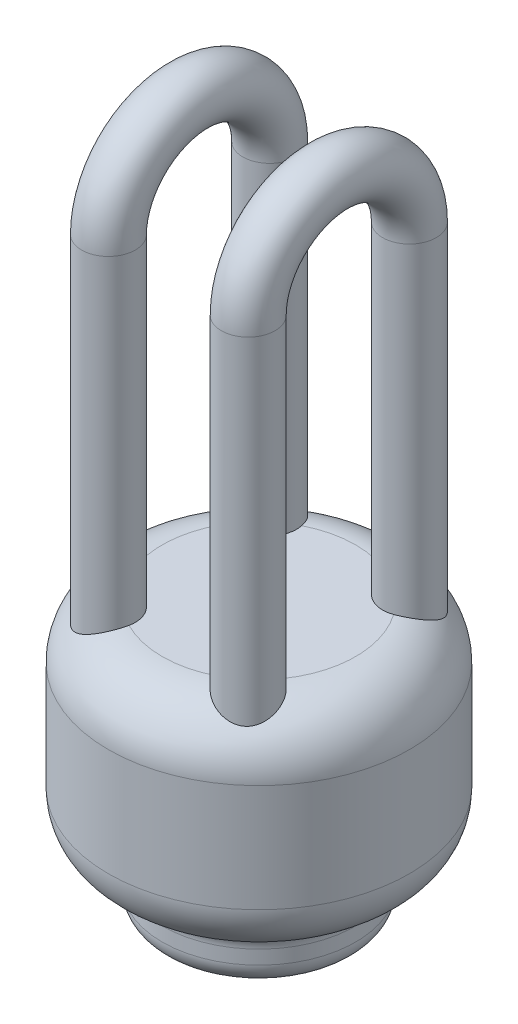
ISO-10303-21;
HEADER;
FILE_DESCRIPTION(('STEP AP214'),'2;1');
FILE_NAME('part.step','',(''),(''),'','','');
FILE_SCHEMA(('AUTOMOTIVE_DESIGN { 1 0 10303 214 1 1 1 1 }'));
ENDSEC;
DATA;
#1=APPLICATION_CONTEXT('core data for automotive mechanical design processes');
#2=APPLICATION_PROTOCOL_DEFINITION('international standard','automotive_design',2000,#1);
#3=PRODUCT_CONTEXT('',#1,'mechanical');
#4=PRODUCT('Part','Part','',(#3));
#5=PRODUCT_RELATED_PRODUCT_CATEGORY('part','',(#4));
#6=PRODUCT_DEFINITION_FORMATION('','',#4);
#7=PRODUCT_DEFINITION_CONTEXT('part definition',#1,'design');
#8=PRODUCT_DEFINITION('design','',#6,#7);
#9=PRODUCT_DEFINITION_SHAPE('','',#8);
#10=(LENGTH_UNIT() NAMED_UNIT(*) SI_UNIT(.MILLI.,.METRE.));
#11=(NAMED_UNIT(*) PLANE_ANGLE_UNIT() SI_UNIT($,.RADIAN.));
#12=(NAMED_UNIT(*) SI_UNIT($,.STERADIAN.) SOLID_ANGLE_UNIT());
#13=UNCERTAINTY_MEASURE_WITH_UNIT(LENGTH_MEASURE(1.E-05),#10,'distance_accuracy_value','');
#14=(GEOMETRIC_REPRESENTATION_CONTEXT(3) GLOBAL_UNCERTAINTY_ASSIGNED_CONTEXT((#13)) GLOBAL_UNIT_ASSIGNED_CONTEXT((#10,
#11,#12)) REPRESENTATION_CONTEXT('',''));
#15=CARTESIAN_POINT('',(0.,0.,0.));
#16=DIRECTION('',(0.,0.,1.));
#17=DIRECTION('',(1.,0.,0.));
#18=AXIS2_PLACEMENT_3D('',#15,#16,#17);
#19=CARTESIAN_POINT('',(0.,40.,0.));
#20=DIRECTION('',(0.,-1.,0.));
#21=DIRECTION('',(0.,0.,-1.));
#22=AXIS2_PLACEMENT_3D('',#19,#20,#21);
#23=CYLINDRICAL_SURFACE('',#22,28.);
#24=CARTESIAN_POINT('',(0.,10.,0.));
#25=DIRECTION('',(0.,1.,0.));
#26=DIRECTION('',(0.,0.,1.));
#27=AXIS2_PLACEMENT_3D('',#24,#25,#26);
#28=CIRCLE('',#27,28.);
#29=CARTESIAN_POINT('',(0.,10.,28.));
#30=VERTEX_POINT('',#29);
#31=EDGE_CURVE('E146',#30,#30,#28,.T.);
#32=ORIENTED_EDGE('',*,*,#31,.T.);
#33=EDGE_LOOP('',(#32));
#34=FACE_BOUND('',#33,.T.);
#35=CARTESIAN_POINT('',(0.,30.,0.));
#36=DIRECTION('',(0.,1.,0.));
#37=DIRECTION('',(0.,0.,1.));
#38=AXIS2_PLACEMENT_3D('',#35,#36,#37);
#39=CIRCLE('',#38,28.);
#40=CARTESIAN_POINT('',(0.,30.,28.));
#41=VERTEX_POINT('',#40);
#42=EDGE_CURVE('E143',#41,#41,#39,.F.);
#43=ORIENTED_EDGE('',*,*,#42,.T.);
#44=EDGE_LOOP('',(#43));
#45=FACE_BOUND('',#44,.T.);
#46=ADVANCED_FACE('F62',(#34,#45),#23,.T.);
#47=CARTESIAN_POINT('',(0.,40.,0.));
#48=DIRECTION('',(0.,1.,0.));
#49=DIRECTION('',(0.,0.,1.));
#50=AXIS2_PLACEMENT_3D('',#47,#48,#49);
#51=PLANE('',#50);
#52=CARTESIAN_POINT('',(13.,40.,-15.));
#53=DIRECTION('',(0.,-1.,0.));
#54=DIRECTION('',(0.,0.,-1.));
#55=AXIS2_PLACEMENT_3D('',#52,#53,#54);
#56=CIRCLE('',#55,5.);
#57=CARTESIAN_POINT('',(14.7503347191497,40.,-10.3163765767369));
#58=VERTEX_POINT('',#57);
#59=CARTESIAN_POINT('',(8.11514751435278,40.,-16.0668721542276));
#60=VERTEX_POINT('',#59);
#61=EDGE_CURVE('E120',#58,#60,#56,.T.);
#62=ORIENTED_EDGE('',*,*,#61,.T.);
#63=CARTESIAN_POINT('',(0.,40.,0.));
#64=DIRECTION('',(0.,1.,0.));
#65=DIRECTION('',(0.,0.,1.));
#66=AXIS2_PLACEMENT_3D('',#63,#64,#65);
#67=CIRCLE('',#66,18.);
#68=CARTESIAN_POINT('',(-8.11514751435278,40.,-16.0668721542276));
#69=VERTEX_POINT('',#68);
#70=EDGE_CURVE('E108',#60,#69,#67,.T.);
#71=ORIENTED_EDGE('',*,*,#70,.T.);
#72=CARTESIAN_POINT('',(-13.,40.,-15.));
#73=DIRECTION('',(0.,1.,0.));
#74=DIRECTION('',(0.,0.,-1.));
#75=AXIS2_PLACEMENT_3D('',#72,#73,#74);
#76=CIRCLE('',#75,5.);
#77=CARTESIAN_POINT('',(-14.7503347191497,40.,-10.3163765767369));
#78=VERTEX_POINT('',#77);
#79=EDGE_CURVE('E118',#69,#78,#76,.F.);
#80=ORIENTED_EDGE('',*,*,#79,.T.);
#81=CARTESIAN_POINT('',(0.,40.,0.));
#82=DIRECTION('',(0.,1.,0.));
#83=DIRECTION('',(0.,0.,1.));
#84=AXIS2_PLACEMENT_3D('',#81,#82,#83);
#85=CIRCLE('',#84,18.);
#86=CARTESIAN_POINT('',(-14.7503347191497,40.,10.3163765767369));
#87=VERTEX_POINT('',#86);
#88=EDGE_CURVE('E110',#78,#87,#85,.T.);
#89=ORIENTED_EDGE('',*,*,#88,.T.);
#90=CARTESIAN_POINT('',(-13.,40.,15.));
#91=DIRECTION('',(0.,-1.,0.));
#92=DIRECTION('',(0.,0.,1.));
#93=AXIS2_PLACEMENT_3D('',#90,#91,#92);
#94=CIRCLE('',#93,5.);
#95=CARTESIAN_POINT('',(-8.11514751435278,40.,16.0668721542276));
#96=VERTEX_POINT('',#95);
#97=EDGE_CURVE('E131',#96,#87,#94,.F.);
#98=ORIENTED_EDGE('',*,*,#97,.F.);
#99=CARTESIAN_POINT('',(0.,40.,0.));
#100=DIRECTION('',(0.,1.,0.));
#101=DIRECTION('',(0.,0.,1.));
#102=AXIS2_PLACEMENT_3D('',#99,#100,#101);
#103=CIRCLE('',#102,18.);
#104=CARTESIAN_POINT('',(8.11514751435278,40.,16.0668721542276));
#105=VERTEX_POINT('',#104);
#106=EDGE_CURVE('E77',#96,#105,#103,.T.);
#107=ORIENTED_EDGE('',*,*,#106,.T.);
#108=CARTESIAN_POINT('',(13.,40.,15.));
#109=DIRECTION('',(0.,1.,0.));
#110=DIRECTION('',(0.,0.,1.));
#111=AXIS2_PLACEMENT_3D('',#108,#109,#110);
#112=CIRCLE('',#111,5.);
#113=CARTESIAN_POINT('',(14.7503347191497,40.,10.3163765767369));
#114=VERTEX_POINT('',#113);
#115=EDGE_CURVE('E141',#114,#105,#112,.T.);
#116=ORIENTED_EDGE('',*,*,#115,.F.);
#117=CARTESIAN_POINT('',(0.,40.,0.));
#118=DIRECTION('',(0.,1.,0.));
#119=DIRECTION('',(0.,0.,1.));
#120=AXIS2_PLACEMENT_3D('',#117,#118,#119);
#121=CIRCLE('',#120,18.);
#122=EDGE_CURVE('E149',#114,#58,#121,.T.);
#123=ORIENTED_EDGE('',*,*,#122,.T.);
#124=EDGE_LOOP('',(#62,#71,#80,#89,#98,#107,#116,#123));
#125=FACE_BOUND('',#124,.T.);
#126=ADVANCED_FACE('F117',(#125),#51,.T.);
#127=CARTESIAN_POINT('',(13.,40.,-15.));
#128=DIRECTION('',(0.,1.,0.));
#129=DIRECTION('',(0.,0.,1.));
#130=AXIS2_PLACEMENT_3D('',#127,#128,#129);
#131=CYLINDRICAL_SURFACE('',#130,5.);
#132=CARTESIAN_POINT('',(13.,100.,-15.));
#133=DIRECTION('',(0.,-1.,0.));
#134=DIRECTION('',(0.,0.,-1.));
#135=AXIS2_PLACEMENT_3D('',#132,#133,#134);
#136=CIRCLE('',#135,5.);
#137=CARTESIAN_POINT('',(13.,100.,-20.));
#138=VERTEX_POINT('',#137);
#139=EDGE_CURVE('E135',#138,#138,#136,.T.);
#140=ORIENTED_EDGE('',*,*,#139,.T.);
#141=EDGE_LOOP('',(#140));
#142=FACE_BOUND('',#141,.T.);
#143=ORIENTED_EDGE('',*,*,#61,.F.);
#144=CARTESIAN_POINT('',(14.7503347191497,40.,-10.3163765767369));
#145=CARTESIAN_POINT('',(14.8715136222727,40.0000248233862,-10.3616397112253));
#146=CARTESIAN_POINT('',(14.9909217024779,39.9976477739751,-10.4116453030019));
#147=CARTESIAN_POINT('',(15.2253267481526,39.9879663805734,-10.5206510724073));
#148=CARTESIAN_POINT('',(15.3403244765662,39.9806628929048,-10.5796496854744));
#149=CARTESIAN_POINT('',(15.5646501574894,39.9610429435948,-10.7059241160429));
#150=CARTESIAN_POINT('',(15.6739982017275,39.9487458558832,-10.773167250837));
#151=CARTESIAN_POINT('',(15.8867430797801,39.9191845540323,-10.9155057552129));
#152=CARTESIAN_POINT('',(15.9901399502426,39.9019203704848,-10.9906010764322));
#153=CARTESIAN_POINT('',(16.1902906243138,39.8625791430644,-11.1479564401782));
#154=CARTESIAN_POINT('',(16.2870470876147,39.8405040410841,-11.2302135838653));
#155=CARTESIAN_POINT('',(16.4734371725936,39.791788944566,-11.4012144658803));
#156=CARTESIAN_POINT('',(16.5630680778671,39.7651472212408,-11.489960653445));
#157=CARTESIAN_POINT('',(16.8206020576563,39.6788217836178,-11.7648886595012));
#158=CARTESIAN_POINT('',(16.9772256769765,39.6127219166901,-11.9598227581244));
#159=CARTESIAN_POINT('',(17.2634574005825,39.463739560605,-12.375263031102));
#160=CARTESIAN_POINT('',(17.3917105096764,39.3802846553234,-12.596486108486));
#161=CARTESIAN_POINT('',(17.6119446737389,39.2024170214425,-13.052170034242));
#162=CARTESIAN_POINT('',(17.7039116422739,39.1080000556976,-13.2866359832549));
#163=CARTESIAN_POINT('',(17.8601676941355,38.9005594151741,-13.7928677967437));
#164=CARTESIAN_POINT('',(17.9197799895744,38.7866651088197,-14.0657213971404));
#165=CARTESIAN_POINT('',(17.9930381016019,38.5563152194418,-14.616690783008));
#166=CARTESIAN_POINT('',(18.006638655244,38.4398572277089,-14.8948114796326));
#167=CARTESIAN_POINT('',(17.9865157072067,38.2008335937344,-15.4759691565353));
#168=CARTESIAN_POINT('',(17.948485307165,38.0786431167219,-15.7790269385135));
#169=CARTESIAN_POINT('',(17.8160305315425,37.8491290128266,-16.378339698949));
#170=CARTESIAN_POINT('',(17.7216753643802,37.7417873396901,-16.6746025634378));
#171=CARTESIAN_POINT('',(17.5054008999052,37.5768171310198,-17.1811699130311));
#172=CARTESIAN_POINT('',(17.3958096484407,37.5134487393941,-17.3948219769374));
#173=CARTESIAN_POINT('',(17.2072582482862,37.4341040998776,-17.7043688634401));
#174=CARTESIAN_POINT('',(17.1403819129654,37.4102741920404,-17.8057274059577));
#175=CARTESIAN_POINT('',(16.9988018305442,37.3684571404922,-18.0040650177123));
#176=CARTESIAN_POINT('',(16.9241013668519,37.3504675587691,-18.101045899786));
#177=CARTESIAN_POINT('',(16.7667730913225,37.3207682765727,-18.2903898269033));
#178=CARTESIAN_POINT('',(16.6841001728419,37.3090971172355,-18.3827214828532));
#179=CARTESIAN_POINT('',(16.5117779240374,37.2925742080336,-18.5612930919373));
#180=CARTESIAN_POINT('',(16.4221286338556,37.2877224189333,-18.6475330801176));
#181=CARTESIAN_POINT('',(16.2365924452043,37.2850017619636,-18.8131259786597));
#182=CARTESIAN_POINT('',(16.1407059958164,37.2871323918976,-18.892479383904));
#183=CARTESIAN_POINT('',(15.94354504352,37.2983031505684,-19.0436335998116));
#184=CARTESIAN_POINT('',(15.8422707982202,37.3073429492304,-19.1154347710848));
#185=CARTESIAN_POINT('',(15.6444689717636,37.3309345169229,-19.2449365156466));
#186=CARTESIAN_POINT('',(15.5483220311393,37.3449236337726,-19.3033233941927));
#187=CARTESIAN_POINT('',(15.3529839412171,37.3780251673999,-19.4131667122779));
#188=CARTESIAN_POINT('',(15.2537917830336,37.3971392986828,-19.4646208238815));
#189=CARTESIAN_POINT('',(14.9526712342147,37.4615095135753,-19.6083027409664));
#190=CARTESIAN_POINT('',(14.7470783459801,37.5138086247384,-19.689928378282));
#191=CARTESIAN_POINT('',(14.314339333164,37.6377194234693,-19.8299479103073));
#192=CARTESIAN_POINT('',(14.0867861450785,37.7105427509231,-19.8859563875095));
#193=CARTESIAN_POINT('',(13.6300963305656,37.8678764727255,-19.9655569278299));
#194=CARTESIAN_POINT('',(13.4009589995542,37.9523924342409,-19.9891334904062));
#195=CARTESIAN_POINT('',(12.9020365095677,38.1447012054112,-20.0063641444706));
#196=CARTESIAN_POINT('',(12.6325701876432,38.2539083141198,-19.9936787718936));
#197=CARTESIAN_POINT('',(12.1002834980953,38.4754468356709,-19.925713369431));
#198=CARTESIAN_POINT('',(11.8374692245881,38.5877809285624,-19.8703956448793));
#199=CARTESIAN_POINT('',(11.2910368838716,38.8234531362012,-19.7085172032883));
#200=CARTESIAN_POINT('',(11.0088371755882,38.9464448227586,-19.5964895488701));
#201=CARTESIAN_POINT('',(10.6017585701513,39.1224254140474,-19.3899512920908));
#202=CARTESIAN_POINT('',(10.4687002294076,39.1796970504897,-19.3146368522289));
#203=CARTESIAN_POINT('',(10.2089796951118,39.2905043348206,-19.1513485629835));
#204=CARTESIAN_POINT('',(10.0823141159186,39.3440419661204,-19.0633815115813));
#205=CARTESIAN_POINT('',(9.84016793361507,39.4449412603011,-18.8778901939276));
#206=CARTESIAN_POINT('',(9.72446670296769,39.4924392588911,-18.7807280359774));
#207=CARTESIAN_POINT('',(9.50133953425253,39.5822216803834,-18.5752422521669));
#208=CARTESIAN_POINT('',(9.39390901226302,39.62450899915,-18.4669248878869));
#209=CARTESIAN_POINT('',(9.18855683265766,39.7030975888196,-18.2398021140514));
#210=CARTESIAN_POINT('',(9.09062661371452,39.7394042702466,-18.1210063351297));
#211=CARTESIAN_POINT('',(8.90544203653154,39.8053871097563,-17.873748286111));
#212=CARTESIAN_POINT('',(8.81818088840743,39.8350674949086,-17.7452922488499));
#213=CARTESIAN_POINT('',(8.66480275900598,39.8842983932188,-17.4950084037662));
#214=CARTESIAN_POINT('',(8.59740842136688,39.9046207290601,-17.3741131016939));
#215=CARTESIAN_POINT('',(8.47260433507555,39.939451663183,-17.1264788405139));
#216=CARTESIAN_POINT('',(8.41519341462396,39.9539609440304,-16.9997405694343));
#217=CARTESIAN_POINT('',(8.31072210162637,39.9771381669158,-16.7407617115113));
#218=CARTESIAN_POINT('',(8.26371837916236,39.9857746331012,-16.6084954467705));
#219=CARTESIAN_POINT('',(8.18090742695463,39.9972238857242,-16.3402032626518));
#220=CARTESIAN_POINT('',(8.14510441952434,40.0000344782334,-16.2041759464573));
#221=CARTESIAN_POINT('',(8.11514751435278,40.,-16.0668721542276));
#222=B_SPLINE_CURVE_WITH_KNOTS('',3,(#144,#145,#146,#147,#148,#149,#150,#151,#152,#153,#154,
#155,#156,#157,#158,#159,#160,#161,#162,#163,#164,#165,#166,#167,#168,#169,#170,#171,#172,#173,
#174,#175,#176,#177,#178,#179,#180,#181,#182,#183,#184,#185,#186,#187,#188,#189,#190,#191,#192,
#193,#194,#195,#196,#197,#198,#199,#200,#201,#202,#203,#204,#205,#206,#207,#208,#209,#210,#211,
#212,#213,#214,#215,#216,#217,#218,#219,#220,#221),.UNSPECIFIED.,.F.,.F.,(4,2,2,2,2,2,2,2,2,2,2,
2,2,2,2,2,2,2,2,2,2,2,2,2,2,2,2,2,2,2,2,2,2,2,2,2,2,2,4),(0.,0.387950147463857,0.77583287813706,
1.16222488302948,1.54861450822664,1.9348484579332,2.32122894860197,3.09368639444171,
3.89750547984637,4.7016363049233,5.60276521190127,6.50478032544876,7.4868449793881,
8.46770540922919,9.20943757277261,9.58028907686685,9.95098557137724,10.3239184689498,
10.6968492208238,11.0697531509771,11.4426392673368,11.7823132521283,12.1221010124082,
12.8012481716432,13.5348108049597,14.2687239162694,15.1383520610769,16.008749996949,
16.986228877606,17.4755088116923,17.9645268412066,18.4389990699304,18.913206407226,
19.3869823571936,19.8604552052582,20.2795630339043,20.6986216366945,21.1199088821841,
21.5413547487373),.UNSPECIFIED.);
#223=EDGE_CURVE('E184',#58,#60,#222,.T.);
#224=ORIENTED_EDGE('',*,*,#223,.T.);
#225=EDGE_LOOP('',(#143,#224));
#226=FACE_BOUND('',#225,.T.);
#227=ADVANCED_FACE('F198',(#142,#226),#131,.T.);
#228=CARTESIAN_POINT('',(13.,100.,0.));
#229=DIRECTION('',(1.,0.,0.));
#230=DIRECTION('',(0.,0.,-1.));
#231=AXIS2_PLACEMENT_3D('',#228,#229,#230);
#232=TOROIDAL_SURFACE('',#231,15.,5.);
#233=CARTESIAN_POINT('',(13.,100.,15.));
#234=DIRECTION('',(0.,1.,0.));
#235=DIRECTION('',(0.,0.,1.));
#236=AXIS2_PLACEMENT_3D('',#233,#234,#235);
#237=CIRCLE('',#236,5.);
#238=CARTESIAN_POINT('',(13.,100.,20.));
#239=VERTEX_POINT('',#238);
#240=EDGE_CURVE('E138',#239,#239,#237,.T.);
#241=CARTESIAN_POINT('',(13.,100.,0.));
#242=DIRECTION('',(1.,0.,0.));
#243=DIRECTION('',(0.,0.,-1.));
#244=AXIS2_PLACEMENT_3D('',#241,#242,#243);
#245=CIRCLE('',#244,20.);
#246=EDGE_CURVE('',#138,#239,#245,.T.);
#247=ORIENTED_EDGE('',*,*,#139,.F.);
#248=ORIENTED_EDGE('',*,*,#240,.T.);
#249=ORIENTED_EDGE('',*,*,#246,.T.);
#250=ORIENTED_EDGE('',*,*,#246,.F.);
#251=EDGE_LOOP('',(#247,#249,#248,#250));
#252=FACE_BOUND('',#251,.T.);
#253=ADVANCED_FACE('F196',(#252),#232,.T.);
#254=CARTESIAN_POINT('',(13.,100.,15.));
#255=DIRECTION('',(0.,-1.,0.));
#256=DIRECTION('',(0.,0.,-1.));
#257=AXIS2_PLACEMENT_3D('',#254,#255,#256);
#258=CYLINDRICAL_SURFACE('',#257,5.);
#259=ORIENTED_EDGE('',*,*,#115,.T.);
#260=CARTESIAN_POINT('',(8.11514751435278,40.,16.0668721542276));
#261=CARTESIAN_POINT('',(8.14272772723497,40.0000248233862,16.1932541535913));
#262=CARTESIAN_POINT('',(8.17525394119787,39.9976477739751,16.3185573627779));
#263=CARTESIAN_POINT('',(8.24983659985357,39.9879663805734,16.5660758675998));
#264=CARTESIAN_POINT('',(8.29189138742976,39.9806628929048,16.6882916960593));
#265=CARTESIAN_POINT('',(8.38499999095768,39.9610429435948,16.9282875937037));
#266=CARTESIAN_POINT('',(8.43601860032912,39.9487458558832,17.0460829053822));
#267=CARTESIAN_POINT('',(8.54667419305922,39.9191845540323,17.276898790371));
#268=CARTESIAN_POINT('',(8.60631112333746,39.9019203704848,17.3899193930833));
#269=CARTESIAN_POINT('',(8.7336211591572,39.8625791430644,17.6104033099806));
#270=CARTESIAN_POINT('',(8.80129101726153,39.8405040410842,17.717868844838));
#271=CARTESIAN_POINT('',(8.94406385793926,39.791788944566,17.9266713385807));
#272=CARTESIAN_POINT('',(9.01916965097207,39.7651472212408,18.0280059567541));
#273=CARTESIAN_POINT('',(9.25470269537239,39.6788217836178,18.3220014401473));
#274=CARTESIAN_POINT('',(9.42539654253252,39.6127219166901,18.5047413413091));
#275=CARTESIAN_POINT('',(9.79593646623641,39.463739560605,18.8471145075352));
#276=CARTESIAN_POINT('',(9.99668475575552,39.3802846553234,19.0055084285508));
#277=CARTESIAN_POINT('',(10.416440131028,39.2024170214425,19.2882739712582));
#278=CARTESIAN_POINT('',(10.6354542677718,39.1080000556976,19.4126323744901));
#279=CARTESIAN_POINT('',(11.114337689996,38.9005594151741,19.6392538003312));
#280=CARTESIAN_POINT('',(11.3759483895142,38.7866651088197,19.7370421171925));
#281=CARTESIAN_POINT('',(11.9109118570645,38.5563152194418,19.887866861607));
#282=CARTESIAN_POINT('',(12.1842759197032,38.4398572277089,19.9408591837679));
#283=CARTESIAN_POINT('',(12.7623936331096,38.2008335937344,20.0035416207528));
#284=CARTESIAN_POINT('',(13.0677800223833,38.0786431167219,20.0089715186577));
#285=CARTESIAN_POINT('',(13.6798344487912,37.8491290128267,19.9630429706668));
#286=CARTESIAN_POINT('',(13.9865004551662,37.7417873396901,19.9117541514233));
#287=CARTESIAN_POINT('',(14.5186645068209,37.5768171310198,19.7696747870375));
#288=CARTESIAN_POINT('',(14.7457239357688,37.5134487393941,19.6915629279197));
#289=CARTESIAN_POINT('',(15.078927398065,37.4341040998776,19.5489222669651));
#290=CARTESIAN_POINT('',(15.1887621857803,37.4102741920404,19.4971311695181));
#291=CARTESIAN_POINT('',(15.4052092751201,37.3684571404922,19.3851785657465));
#292=CARTESIAN_POINT('',(15.5118229044996,37.3504675587691,19.325020567158));
#293=CARTESIAN_POINT('',(15.7216059375082,37.3207682765727,19.196201360209));
#294=CARTESIAN_POINT('',(15.8247506818111,37.3090971172355,19.1274910417465));
#295=CARTESIAN_POINT('',(16.0260018835266,37.2925742080336,18.9822989937134));
#296=CARTESIAN_POINT('',(16.1241083699238,37.2877224189333,18.9058173088585));
#297=CARTESIAN_POINT('',(16.3143907480859,37.2850017619636,18.745700782829));
#298=CARTESIAN_POINT('',(16.4065670658803,37.2871323918976,18.6620664565153));
#299=CARTESIAN_POINT('',(16.5842095976888,37.2983031505684,18.4883909861986));
#300=CARTESIAN_POINT('',(16.6696761320374,37.3073429492304,18.3983501484432));
#301=CARTESIAN_POINT('',(16.8259771032574,37.3309345169229,18.2209628016853));
#302=CARTESIAN_POINT('',(16.8974367766277,37.3449236337726,18.1340906147693));
#303=CARTESIAN_POINT('',(17.0339287235539,37.3780251674,17.9563479009193));
#304=CARTESIAN_POINT('',(17.0989588362028,37.3971392986828,17.8654760444682));
#305=CARTESIAN_POINT('',(17.2839809133524,37.4615095135753,17.5878343523804));
#306=CARTESIAN_POINT('',(17.3939991882108,37.5138086247384,17.3959303150153));
#307=CARTESIAN_POINT('',(17.5941032547276,37.6377194234693,16.9874858449522));
#308=CARTESIAN_POINT('',(17.6818857030566,37.7105427509231,16.7702034372618));
#309=CARTESIAN_POINT('',(17.8255883435076,37.8678764727255,16.3294638499469));
#310=CARTESIAN_POINT('',(17.8814932925974,37.9523924342409,16.1060037697687));
#311=CARTESIAN_POINT('',(17.9694618573801,38.1447012054112,15.6145955096999));
#312=CARTESIAN_POINT('',(17.9952050521078,38.2539083141198,15.3460618893575));
#313=CARTESIAN_POINT('',(18.0035846146821,38.4754468356709,14.8095190683891));
#314=CARTESIAN_POINT('',(17.9861828043807,38.5877809285623,14.5415105423923));
#315=CARTESIAN_POINT('',(17.9036133091006,38.8234531362012,13.9776176347566));
#316=CARTESIAN_POINT('',(17.8328325944833,38.9464448227586,13.6823601858277));
#317=CARTESIAN_POINT('',(17.6862500608805,39.1224254140474,13.2500586667921));
#318=CARTESIAN_POINT('',(17.6306120800062,39.1796970504897,13.1076465817101));
#319=CARTESIAN_POINT('',(17.5058961335972,39.2905043348206,12.8273543162961));
#320=CARTESIAN_POINT('',(17.4368253782367,39.3440419661204,12.6894717509056));
#321=CARTESIAN_POINT('',(17.2876339374348,39.4449412603011,12.4234196572838));
#322=CARTESIAN_POINT('',(17.207903042297,39.4924392588911,12.2950832085587));
#323=CARTESIAN_POINT('',(17.0362169147892,39.5822216803834,12.0450151890351));
#324=CARTESIAN_POINT('',(16.9442685319522,39.62450899915,11.923279970823));
#325=CARTESIAN_POINT('',(16.7486386849016,39.7030975888196,11.68773117544));
#326=CARTESIAN_POINT('',(16.6449679703872,39.7394042702466,11.57391049268));
#327=CARTESIAN_POINT('',(16.4265408059327,39.8053871097563,11.3554626859632));
#328=CARTESIAN_POINT('',(16.3117914906108,39.8350674949086,11.2508297269403));
#329=CARTESIAN_POINT('',(16.0858485354428,39.8842983932188,11.0634353975209));
#330=CARTESIAN_POINT('',(15.9757594874722,39.9046207290601,10.9795421777359));
#331=CARTESIAN_POINT('',(15.7483779315639,39.939451663183,10.820808390224));
#332=CARTESIAN_POINT('',(15.6310862712194,39.9539609440304,10.7459667603849));
#333=CARTESIAN_POINT('',(15.3895853548181,39.9771381669158,10.6057468920785));
#334=CARTESIAN_POINT('',(15.2653426269223,39.9857746331012,10.5404210987118));
#335=CARTESIAN_POINT('',(15.0115443059004,39.9972238857242,10.4203179675655));
#336=CARTESIAN_POINT('',(14.8819867300126,40.0000344782334,10.3655446107008));
#337=CARTESIAN_POINT('',(14.7503347191497,40.,10.3163765767369));
#338=B_SPLINE_CURVE_WITH_KNOTS('',3,(#260,#261,#262,#263,#264,#265,#266,#267,#268,#269,#270,
#271,#272,#273,#274,#275,#276,#277,#278,#279,#280,#281,#282,#283,#284,#285,#286,#287,#288,#289,
#290,#291,#292,#293,#294,#295,#296,#297,#298,#299,#300,#301,#302,#303,#304,#305,#306,#307,#308,
#309,#310,#311,#312,#313,#314,#315,#316,#317,#318,#319,#320,#321,#322,#323,#324,#325,#326,#327,
#328,#329,#330,#331,#332,#333,#334,#335,#336,#337),.UNSPECIFIED.,.F.,.F.,(4,2,2,2,2,2,2,2,2,2,2,
2,2,2,2,2,2,2,2,2,2,2,2,2,2,2,2,2,2,2,2,2,2,2,2,2,2,2,4),(0.,0.387950147463858,
0.775832878137062,1.16222488302948,1.54861450822664,1.9348484579332,2.32122894860196,
3.09368639444171,3.89750547984637,4.7016363049233,5.60276521190127,6.50478032544876,
7.48684497938811,8.4677054092292,9.20943757277261,9.58028907686685,9.95098557137723,
10.3239184689498,10.6968492208238,11.0697531509771,11.4426392673368,11.7823132521283,
12.1221010124082,12.8012481716432,13.5348108049597,14.2687239162694,15.1383520610769,
16.008749996949,16.986228877606,17.4755088116923,17.9645268412066,18.4389990699304,
18.9132064072259,19.3869823571936,19.8604552052582,20.2795630339043,20.6986216366945,
21.1199088821841,21.5413547487372),.UNSPECIFIED.);
#339=EDGE_CURVE('E83',#105,#114,#338,.T.);
#340=ORIENTED_EDGE('',*,*,#339,.T.);
#341=EDGE_LOOP('',(#259,#340));
#342=FACE_BOUND('',#341,.T.);
#343=ORIENTED_EDGE('',*,*,#240,.F.);
#344=EDGE_LOOP('',(#343));
#345=FACE_BOUND('',#344,.T.);
#346=ADVANCED_FACE('F191',(#342,#345),#258,.T.);
#347=CARTESIAN_POINT('',(-13.,40.,-15.));
#348=DIRECTION('',(0.,1.,0.));
#349=DIRECTION('',(0.,0.,1.));
#350=AXIS2_PLACEMENT_3D('',#347,#348,#349);
#351=CYLINDRICAL_SURFACE('',#350,5.);
#352=CARTESIAN_POINT('',(-13.,100.,-15.));
#353=DIRECTION('',(0.,1.,0.));
#354=DIRECTION('',(0.,0.,-1.));
#355=AXIS2_PLACEMENT_3D('',#352,#353,#354);
#356=CIRCLE('',#355,5.);
#357=CARTESIAN_POINT('',(-13.,100.,-20.));
#358=VERTEX_POINT('',#357);
#359=EDGE_CURVE('E123',#358,#358,#356,.F.);
#360=ORIENTED_EDGE('',*,*,#359,.T.);
#361=EDGE_LOOP('',(#360));
#362=FACE_BOUND('',#361,.T.);
#363=ORIENTED_EDGE('',*,*,#79,.F.);
#364=CARTESIAN_POINT('',(-8.11514751435278,40.,-16.0668721542276));
#365=CARTESIAN_POINT('',(-8.14272772723497,40.0000248233862,-16.1932541535913));
#366=CARTESIAN_POINT('',(-8.17525394119787,39.9976477739751,-16.3185573627779));
#367=CARTESIAN_POINT('',(-8.24983659985357,39.9879663805734,-16.5660758675998));
#368=CARTESIAN_POINT('',(-8.29189138742976,39.9806628929048,-16.6882916960593));
#369=CARTESIAN_POINT('',(-8.38499999095768,39.9610429435948,-16.9282875937037));
#370=CARTESIAN_POINT('',(-8.43601860032912,39.9487458558832,-17.0460829053822));
#371=CARTESIAN_POINT('',(-8.54667419305922,39.9191845540323,-17.276898790371));
#372=CARTESIAN_POINT('',(-8.60631112333746,39.9019203704848,-17.3899193930833));
#373=CARTESIAN_POINT('',(-8.7336211591572,39.8625791430644,-17.6104033099806));
#374=CARTESIAN_POINT('',(-8.80129101726153,39.8405040410841,-17.7178688448381));
#375=CARTESIAN_POINT('',(-8.94406385793927,39.791788944566,-17.9266713385808));
#376=CARTESIAN_POINT('',(-9.01916965097207,39.7651472212408,-18.0280059567541));
#377=CARTESIAN_POINT('',(-9.25470269537239,39.6788217836178,-18.3220014401473));
#378=CARTESIAN_POINT('',(-9.42539654253252,39.6127219166901,-18.5047413413091));
#379=CARTESIAN_POINT('',(-9.79593646623641,39.463739560605,-18.8471145075352));
#380=CARTESIAN_POINT('',(-9.99668475575552,39.3802846553234,-19.0055084285509));
#381=CARTESIAN_POINT('',(-10.416440131028,39.2024170214425,-19.2882739712582));
#382=CARTESIAN_POINT('',(-10.6354542677718,39.1080000556976,-19.4126323744901));
#383=CARTESIAN_POINT('',(-11.114337689996,38.9005594151741,-19.6392538003312));
#384=CARTESIAN_POINT('',(-11.3759483895142,38.7866651088197,-19.7370421171926));
#385=CARTESIAN_POINT('',(-11.9109118570646,38.5563152194418,-19.887866861607));
#386=CARTESIAN_POINT('',(-12.1842759197032,38.4398572277089,-19.9408591837679));
#387=CARTESIAN_POINT('',(-12.7623936331096,38.2008335937344,-20.0035416207528));
#388=CARTESIAN_POINT('',(-13.0677800223833,38.0786431167219,-20.0089715186577));
#389=CARTESIAN_POINT('',(-13.6798344487912,37.8491290128267,-19.9630429706668));
#390=CARTESIAN_POINT('',(-13.9865004551662,37.7417873396901,-19.9117541514233));
#391=CARTESIAN_POINT('',(-14.5186645068209,37.5768171310198,-19.7696747870375));
#392=CARTESIAN_POINT('',(-14.7457239357688,37.5134487393941,-19.6915629279197));
#393=CARTESIAN_POINT('',(-15.078927398065,37.4341040998776,-19.5489222669651));
#394=CARTESIAN_POINT('',(-15.1887621857803,37.4102741920404,-19.4971311695182));
#395=CARTESIAN_POINT('',(-15.4052092751201,37.3684571404922,-19.3851785657465));
#396=CARTESIAN_POINT('',(-15.5118229044996,37.3504675587691,-19.325020567158));
#397=CARTESIAN_POINT('',(-15.7216059375082,37.3207682765727,-19.196201360209));
#398=CARTESIAN_POINT('',(-15.8247506818111,37.3090971172355,-19.1274910417465));
#399=CARTESIAN_POINT('',(-16.0260018835265,37.2925742080336,-18.9822989937134));
#400=CARTESIAN_POINT('',(-16.1241083699238,37.2877224189333,-18.9058173088585));
#401=CARTESIAN_POINT('',(-16.3143907480859,37.2850017619636,-18.745700782829));
#402=CARTESIAN_POINT('',(-16.4065670658803,37.2871323918976,-18.6620664565153));
#403=CARTESIAN_POINT('',(-16.5842095976888,37.2983031505684,-18.4883909861987));
#404=CARTESIAN_POINT('',(-16.6696761320374,37.3073429492304,-18.3983501484432));
#405=CARTESIAN_POINT('',(-16.8259771032574,37.3309345169229,-18.2209628016853));
#406=CARTESIAN_POINT('',(-16.8974367766277,37.3449236337726,-18.1340906147693));
#407=CARTESIAN_POINT('',(-17.0339287235539,37.3780251673999,-17.9563479009193));
#408=CARTESIAN_POINT('',(-17.0989588362028,37.3971392986828,-17.8654760444682));
#409=CARTESIAN_POINT('',(-17.2839809133524,37.4615095135753,-17.5878343523804));
#410=CARTESIAN_POINT('',(-17.3939991882108,37.5138086247384,-17.3959303150153));
#411=CARTESIAN_POINT('',(-17.5941032547276,37.6377194234693,-16.9874858449522));
#412=CARTESIAN_POINT('',(-17.6818857030566,37.7105427509231,-16.7702034372618));
#413=CARTESIAN_POINT('',(-17.8255883435076,37.8678764727255,-16.3294638499469));
#414=CARTESIAN_POINT('',(-17.8814932925974,37.9523924342409,-16.1060037697687));
#415=CARTESIAN_POINT('',(-17.9694618573801,38.1447012054112,-15.6145955096999));
#416=CARTESIAN_POINT('',(-17.9952050521078,38.2539083141198,-15.3460618893575));
#417=CARTESIAN_POINT('',(-18.0035846146821,38.4754468356709,-14.8095190683891));
#418=CARTESIAN_POINT('',(-17.9861828043807,38.5877809285623,-14.5415105423923));
#419=CARTESIAN_POINT('',(-17.9036133091006,38.8234531362012,-13.9776176347566));
#420=CARTESIAN_POINT('',(-17.8328325944833,38.9464448227586,-13.6823601858278));
#421=CARTESIAN_POINT('',(-17.6862500608805,39.1224254140474,-13.2500586667921));
#422=CARTESIAN_POINT('',(-17.6306120800062,39.1796970504897,-13.1076465817101));
#423=CARTESIAN_POINT('',(-17.5058961335972,39.2905043348206,-12.8273543162961));
#424=CARTESIAN_POINT('',(-17.4368253782367,39.3440419661204,-12.6894717509056));
#425=CARTESIAN_POINT('',(-17.2876339374348,39.4449412603011,-12.4234196572838));
#426=CARTESIAN_POINT('',(-17.207903042297,39.4924392588911,-12.2950832085587));
#427=CARTESIAN_POINT('',(-17.0362169147892,39.5822216803834,-12.0450151890351));
#428=CARTESIAN_POINT('',(-16.9442685319522,39.62450899915,-11.923279970823));
#429=CARTESIAN_POINT('',(-16.7486386849016,39.7030975888196,-11.68773117544));
#430=CARTESIAN_POINT('',(-16.6449679703872,39.7394042702466,-11.57391049268));
#431=CARTESIAN_POINT('',(-16.4265408059328,39.8053871097563,-11.3554626859632));
#432=CARTESIAN_POINT('',(-16.3117914906108,39.8350674949086,-11.2508297269403));
#433=CARTESIAN_POINT('',(-16.0858485354428,39.8842983932188,-11.0634353975209));
#434=CARTESIAN_POINT('',(-15.9757594874723,39.9046207290601,-10.9795421777359));
#435=CARTESIAN_POINT('',(-15.7483779315639,39.939451663183,-10.820808390224));
#436=CARTESIAN_POINT('',(-15.6310862712194,39.9539609440304,-10.7459667603849));
#437=CARTESIAN_POINT('',(-15.3895853548181,39.9771381669158,-10.6057468920785));
#438=CARTESIAN_POINT('',(-15.2653426269223,39.9857746331012,-10.5404210987119));
#439=CARTESIAN_POINT('',(-15.0115443059004,39.9972238857242,-10.4203179675655));
#440=CARTESIAN_POINT('',(-14.8819867300126,40.0000344782334,-10.3655446107008));
#441=CARTESIAN_POINT('',(-14.7503347191497,40.,-10.3163765767369));
#442=B_SPLINE_CURVE_WITH_KNOTS('',3,(#364,#365,#366,#367,#368,#369,#370,#371,#372,#373,#374,
#375,#376,#377,#378,#379,#380,#381,#382,#383,#384,#385,#386,#387,#388,#389,#390,#391,#392,#393,
#394,#395,#396,#397,#398,#399,#400,#401,#402,#403,#404,#405,#406,#407,#408,#409,#410,#411,#412,
#413,#414,#415,#416,#417,#418,#419,#420,#421,#422,#423,#424,#425,#426,#427,#428,#429,#430,#431,
#432,#433,#434,#435,#436,#437,#438,#439,#440,#441),.UNSPECIFIED.,.F.,.F.,(4,2,2,2,2,2,2,2,2,2,2,
2,2,2,2,2,2,2,2,2,2,2,2,2,2,2,2,2,2,2,2,2,2,2,2,2,2,2,4),(0.,0.387950147463858,
0.775832878137062,1.16222488302948,1.54861450822664,1.9348484579332,2.32122894860197,
3.09368639444171,3.89750547984637,4.7016363049233,5.60276521190127,6.50478032544877,
7.48684497938811,8.4677054092292,9.20943757277262,9.58028907686685,9.95098557137724,
10.3239184689498,10.6968492208238,11.0697531509771,11.4426392673368,11.7823132521283,
12.1221010124082,12.8012481716432,13.5348108049597,14.2687239162694,15.138352061077,
16.008749996949,16.986228877606,17.4755088116923,17.9645268412066,18.4389990699304,
18.913206407226,19.3869823571936,19.8604552052582,20.2795630339043,20.6986216366945,
21.1199088821841,21.5413547487373),.UNSPECIFIED.);
#443=EDGE_CURVE('E104',#69,#78,#442,.T.);
#444=ORIENTED_EDGE('',*,*,#443,.T.);
#445=EDGE_LOOP('',(#363,#444));
#446=FACE_BOUND('',#445,.T.);
#447=ADVANCED_FACE('F122',(#362,#446),#351,.T.);
#448=CARTESIAN_POINT('',(-13.,100.,0.));
#449=DIRECTION('',(1.,0.,0.));
#450=DIRECTION('',(0.,0.,-1.));
#451=AXIS2_PLACEMENT_3D('',#448,#449,#450);
#452=TOROIDAL_SURFACE('',#451,15.,5.);
#453=CARTESIAN_POINT('',(-13.,100.,15.));
#454=DIRECTION('',(0.,-1.,0.));
#455=DIRECTION('',(0.,0.,1.));
#456=AXIS2_PLACEMENT_3D('',#453,#454,#455);
#457=CIRCLE('',#456,5.);
#458=CARTESIAN_POINT('',(-13.,100.,20.));
#459=VERTEX_POINT('',#458);
#460=EDGE_CURVE('E126',#459,#459,#457,.F.);
#461=CARTESIAN_POINT('',(-13.,100.,0.));
#462=DIRECTION('',(1.,0.,0.));
#463=DIRECTION('',(0.,0.,-1.));
#464=AXIS2_PLACEMENT_3D('',#461,#462,#463);
#465=CIRCLE('',#464,20.);
#466=EDGE_CURVE('',#358,#459,#465,.T.);
#467=ORIENTED_EDGE('',*,*,#359,.F.);
#468=ORIENTED_EDGE('',*,*,#460,.T.);
#469=ORIENTED_EDGE('',*,*,#466,.T.);
#470=ORIENTED_EDGE('',*,*,#466,.F.);
#471=EDGE_LOOP('',(#467,#469,#468,#470));
#472=FACE_BOUND('',#471,.T.);
#473=ADVANCED_FACE('F241',(#472),#452,.T.);
#474=CARTESIAN_POINT('',(-13.,100.,15.));
#475=DIRECTION('',(0.,-1.,0.));
#476=DIRECTION('',(0.,0.,-1.));
#477=AXIS2_PLACEMENT_3D('',#474,#475,#476);
#478=CYLINDRICAL_SURFACE('',#477,5.);
#479=ORIENTED_EDGE('',*,*,#97,.T.);
#480=CARTESIAN_POINT('',(-14.7503347191497,40.,10.3163765767369));
#481=CARTESIAN_POINT('',(-14.8715136222727,40.0000248233862,10.3616397112252));
#482=CARTESIAN_POINT('',(-14.9909217024779,39.9976477739751,10.4116453030019));
#483=CARTESIAN_POINT('',(-15.2253267481526,39.9879663805734,10.5206510724073));
#484=CARTESIAN_POINT('',(-15.3403244765662,39.9806628929048,10.5796496854744));
#485=CARTESIAN_POINT('',(-15.5646501574894,39.9610429435948,10.7059241160429));
#486=CARTESIAN_POINT('',(-15.6739982017275,39.9487458558832,10.7731672508369));
#487=CARTESIAN_POINT('',(-15.8867430797801,39.9191845540323,10.9155057552129));
#488=CARTESIAN_POINT('',(-15.9901399502426,39.9019203704848,10.9906010764322));
#489=CARTESIAN_POINT('',(-16.1902906243138,39.8625791430644,11.1479564401782));
#490=CARTESIAN_POINT('',(-16.2870470876147,39.8405040410841,11.2302135838653));
#491=CARTESIAN_POINT('',(-16.4734371725936,39.791788944566,11.4012144658803));
#492=CARTESIAN_POINT('',(-16.5630680778671,39.7651472212408,11.489960653445));
#493=CARTESIAN_POINT('',(-16.8206020576563,39.6788217836178,11.7648886595012));
#494=CARTESIAN_POINT('',(-16.9772256769765,39.6127219166901,11.9598227581243));
#495=CARTESIAN_POINT('',(-17.2634574005825,39.463739560605,12.375263031102));
#496=CARTESIAN_POINT('',(-17.3917105096765,39.3802846553234,12.596486108486));
#497=CARTESIAN_POINT('',(-17.6119446737389,39.2024170214425,13.052170034242));
#498=CARTESIAN_POINT('',(-17.7039116422739,39.1080000556976,13.2866359832549));
#499=CARTESIAN_POINT('',(-17.8601676941355,38.9005594151741,13.7928677967436));
#500=CARTESIAN_POINT('',(-17.9197799895744,38.7866651088197,14.0657213971404));
#501=CARTESIAN_POINT('',(-17.9930381016019,38.5563152194419,14.616690783008));
#502=CARTESIAN_POINT('',(-18.006638655244,38.4398572277089,14.8948114796326));
#503=CARTESIAN_POINT('',(-17.9865157072067,38.2008335937344,15.4759691565353));
#504=CARTESIAN_POINT('',(-17.948485307165,38.0786431167219,15.7790269385135));
#505=CARTESIAN_POINT('',(-17.8160305315425,37.8491290128267,16.378339698949));
#506=CARTESIAN_POINT('',(-17.7216753643801,37.7417873396901,16.6746025634378));
#507=CARTESIAN_POINT('',(-17.5054008999052,37.5768171310198,17.1811699130311));
#508=CARTESIAN_POINT('',(-17.3958096484407,37.5134487393941,17.3948219769374));
#509=CARTESIAN_POINT('',(-17.2072582482862,37.4341040998776,17.7043688634401));
#510=CARTESIAN_POINT('',(-17.1403819129654,37.4102741920404,17.8057274059577));
#511=CARTESIAN_POINT('',(-16.9988018305442,37.3684571404922,18.0040650177123));
#512=CARTESIAN_POINT('',(-16.9241013668519,37.3504675587691,18.101045899786));
#513=CARTESIAN_POINT('',(-16.7667730913225,37.3207682765727,18.2903898269033));
#514=CARTESIAN_POINT('',(-16.6841001728419,37.3090971172355,18.3827214828532));
#515=CARTESIAN_POINT('',(-16.5117779240374,37.2925742080336,18.5612930919373));
#516=CARTESIAN_POINT('',(-16.4221286338556,37.2877224189333,18.6475330801176));
#517=CARTESIAN_POINT('',(-16.2365924452043,37.2850017619636,18.8131259786597));
#518=CARTESIAN_POINT('',(-16.1407059958164,37.2871323918976,18.892479383904));
#519=CARTESIAN_POINT('',(-15.94354504352,37.2983031505684,19.0436335998116));
#520=CARTESIAN_POINT('',(-15.8422707982202,37.3073429492305,19.1154347710848));
#521=CARTESIAN_POINT('',(-15.6444689717636,37.3309345169229,19.2449365156466));
#522=CARTESIAN_POINT('',(-15.5483220311392,37.3449236337726,19.3033233941926));
#523=CARTESIAN_POINT('',(-15.3529839412171,37.3780251674,19.4131667122779));
#524=CARTESIAN_POINT('',(-15.2537917830336,37.3971392986828,19.4646208238815));
#525=CARTESIAN_POINT('',(-14.9526712342147,37.4615095135753,19.6083027409664));
#526=CARTESIAN_POINT('',(-14.7470783459801,37.5138086247384,19.6899283782819));
#527=CARTESIAN_POINT('',(-14.314339333164,37.6377194234693,19.8299479103073));
#528=CARTESIAN_POINT('',(-14.0867861450785,37.7105427509231,19.8859563875095));
#529=CARTESIAN_POINT('',(-13.6300963305656,37.8678764727255,19.9655569278299));
#530=CARTESIAN_POINT('',(-13.4009589995542,37.9523924342409,19.9891334904062));
#531=CARTESIAN_POINT('',(-12.9020365095677,38.1447012054112,20.0063641444706));
#532=CARTESIAN_POINT('',(-12.6325701876431,38.2539083141198,19.9936787718935));
#533=CARTESIAN_POINT('',(-12.1002834980953,38.4754468356709,19.9257133694309));
#534=CARTESIAN_POINT('',(-11.8374692245881,38.5877809285624,19.8703956448793));
#535=CARTESIAN_POINT('',(-11.2910368838716,38.8234531362012,19.7085172032883));
#536=CARTESIAN_POINT('',(-11.0088371755882,38.9464448227586,19.5964895488701));
#537=CARTESIAN_POINT('',(-10.6017585701513,39.1224254140474,19.3899512920907));
#538=CARTESIAN_POINT('',(-10.4687002294076,39.1796970504897,19.3146368522289));
#539=CARTESIAN_POINT('',(-10.2089796951118,39.2905043348206,19.1513485629835));
#540=CARTESIAN_POINT('',(-10.0823141159186,39.3440419661204,19.0633815115813));
#541=CARTESIAN_POINT('',(-9.84016793361506,39.4449412603011,18.8778901939276));
#542=CARTESIAN_POINT('',(-9.72446670296769,39.4924392588911,18.7807280359774));
#543=CARTESIAN_POINT('',(-9.50133953425253,39.5822216803834,18.5752422521668));
#544=CARTESIAN_POINT('',(-9.39390901226301,39.62450899915,18.4669248878869));
#545=CARTESIAN_POINT('',(-9.18855683265765,39.7030975888196,18.2398021140514));
#546=CARTESIAN_POINT('',(-9.09062661371452,39.7394042702466,18.1210063351297));
#547=CARTESIAN_POINT('',(-8.90544203653154,39.8053871097563,17.8737482861109));
#548=CARTESIAN_POINT('',(-8.81818088840743,39.8350674949086,17.7452922488499));
#549=CARTESIAN_POINT('',(-8.66480275900598,39.8842983932188,17.4950084037661));
#550=CARTESIAN_POINT('',(-8.59740842136688,39.9046207290601,17.3741131016939));
#551=CARTESIAN_POINT('',(-8.47260433507555,39.939451663183,17.1264788405139));
#552=CARTESIAN_POINT('',(-8.41519341462397,39.9539609440304,16.9997405694343));
#553=CARTESIAN_POINT('',(-8.31072210162637,39.9771381669158,16.7407617115113));
#554=CARTESIAN_POINT('',(-8.26371837916237,39.9857746331012,16.6084954467705));
#555=CARTESIAN_POINT('',(-8.18090742695463,39.9972238857242,16.3402032626518));
#556=CARTESIAN_POINT('',(-8.14510441952434,40.0000344782334,16.2041759464573));
#557=CARTESIAN_POINT('',(-8.11514751435278,40.,16.0668721542276));
#558=B_SPLINE_CURVE_WITH_KNOTS('',3,(#480,#481,#482,#483,#484,#485,#486,#487,#488,#489,#490,
#491,#492,#493,#494,#495,#496,#497,#498,#499,#500,#501,#502,#503,#504,#505,#506,#507,#508,#509,
#510,#511,#512,#513,#514,#515,#516,#517,#518,#519,#520,#521,#522,#523,#524,#525,#526,#527,#528,
#529,#530,#531,#532,#533,#534,#535,#536,#537,#538,#539,#540,#541,#542,#543,#544,#545,#546,#547,
#548,#549,#550,#551,#552,#553,#554,#555,#556,#557),.UNSPECIFIED.,.F.,.F.,(4,2,2,2,2,2,2,2,2,2,2,
2,2,2,2,2,2,2,2,2,2,2,2,2,2,2,2,2,2,2,2,2,2,2,2,2,2,2,4),(0.,0.38795014746386,0.775832878137061,
1.16222488302948,1.54861450822664,1.93484845793321,2.32122894860197,3.09368639444171,
3.89750547984637,4.7016363049233,5.60276521190127,6.50478032544877,7.4868449793881,
8.4677054092292,9.20943757277262,9.58028907686684,9.95098557137724,10.3239184689498,
10.6968492208238,11.0697531509771,11.4426392673368,11.7823132521283,12.1221010124082,
12.8012481716432,13.5348108049597,14.2687239162694,15.138352061077,16.008749996949,
16.986228877606,17.4755088116923,17.9645268412066,18.4389990699304,18.913206407226,
19.3869823571936,19.8604552052582,20.2795630339043,20.6986216366945,21.119908882184,
21.5413547487372),.UNSPECIFIED.);
#559=EDGE_CURVE('E114',#87,#96,#558,.T.);
#560=ORIENTED_EDGE('',*,*,#559,.T.);
#561=EDGE_LOOP('',(#479,#560));
#562=FACE_BOUND('',#561,.T.);
#563=ORIENTED_EDGE('',*,*,#460,.F.);
#564=EDGE_LOOP('',(#563));
#565=FACE_BOUND('',#564,.T.);
#566=ADVANCED_FACE('F236',(#562,#565),#478,.T.);
#567=CARTESIAN_POINT('',(0.,-10.,0.));
#568=DIRECTION('',(0.,1.,0.));
#569=DIRECTION('',(0.,0.,1.));
#570=AXIS2_PLACEMENT_3D('',#567,#568,#569);
#571=CYLINDRICAL_SURFACE('',#570,18.);
#572=CARTESIAN_POINT('',(0.,-3.41640786499874,0.));
#573=DIRECTION('',(0.,-1.,0.));
#574=DIRECTION('',(0.,0.,-1.));
#575=AXIS2_PLACEMENT_3D('',#572,#573,#574);
#576=CIRCLE('',#575,18.);
#577=CARTESIAN_POINT('',(0.,-3.41640786499874,-18.));
#578=VERTEX_POINT('',#577);
#579=EDGE_CURVE('E219',#578,#578,#576,.T.);
#580=ORIENTED_EDGE('',*,*,#579,.T.);
#581=EDGE_LOOP('',(#580));
#582=FACE_BOUND('',#581,.T.);
#583=CARTESIAN_POINT('',(0.,-6.,0.));
#584=DIRECTION('',(0.,-1.,0.));
#585=DIRECTION('',(0.,0.,-1.));
#586=AXIS2_PLACEMENT_3D('',#583,#584,#585);
#587=CIRCLE('',#586,18.);
#588=CARTESIAN_POINT('',(0.,-6.,-18.));
#589=VERTEX_POINT('',#588);
#590=EDGE_CURVE('E221',#589,#589,#587,.F.);
#591=ORIENTED_EDGE('',*,*,#590,.T.);
#592=EDGE_LOOP('',(#591));
#593=FACE_BOUND('',#592,.T.);
#594=ADVANCED_FACE('F213',(#582,#593),#571,.T.);
#595=CARTESIAN_POINT('',(0.,-10.,0.));
#596=DIRECTION('',(0.,-1.,0.));
#597=DIRECTION('',(0.,0.,-1.));
#598=AXIS2_PLACEMENT_3D('',#595,#596,#597);
#599=PLANE('',#598);
#600=CARTESIAN_POINT('',(0.,-10.,0.));
#601=DIRECTION('',(0.,-1.,0.));
#602=DIRECTION('',(0.,0.,-1.));
#603=AXIS2_PLACEMENT_3D('',#600,#601,#602);
#604=CIRCLE('',#603,14.);
#605=CARTESIAN_POINT('',(0.,-10.,-14.));
#606=VERTEX_POINT('',#605);
#607=EDGE_CURVE('E12',#606,#606,#604,.T.);
#608=ORIENTED_EDGE('',*,*,#607,.T.);
#609=EDGE_LOOP('',(#608));
#610=FACE_BOUND('',#609,.T.);
#611=ADVANCED_FACE('F208',(#610),#599,.T.);
#612=CARTESIAN_POINT('',(0.,10.,0.));
#613=DIRECTION('',(0.,1.,0.));
#614=DIRECTION('',(0.,0.,1.));
#615=AXIS2_PLACEMENT_3D('',#612,#613,#614);
#616=TOROIDAL_SURFACE('',#615,18.,10.);
#617=CARTESIAN_POINT('',(0.,0.416851525000832,0.));
#618=DIRECTION('',(0.,1.,0.));
#619=DIRECTION('',(0.,0.,1.));
#620=AXIS2_PLACEMENT_3D('',#617,#618,#619);
#621=CIRCLE('',#620,20.8571428571429);
#622=CARTESIAN_POINT('',(0.,0.416851525000832,20.8571428571429));
#623=VERTEX_POINT('',#622);
#624=EDGE_CURVE('E70',#623,#623,#621,.T.);
#625=ORIENTED_EDGE('',*,*,#624,.T.);
#626=EDGE_LOOP('',(#625));
#627=FACE_BOUND('',#626,.T.);
#628=ORIENTED_EDGE('',*,*,#31,.F.);
#629=EDGE_LOOP('',(#628));
#630=FACE_BOUND('',#629,.T.);
#631=ADVANCED_FACE('F172',(#627,#630),#616,.T.);
#632=CARTESIAN_POINT('',(0.,30.,0.));
#633=DIRECTION('',(0.,1.,0.));
#634=DIRECTION('',(0.,0.,1.));
#635=AXIS2_PLACEMENT_3D('',#632,#633,#634);
#636=TOROIDAL_SURFACE('',#635,18.,10.);
#637=ORIENTED_EDGE('',*,*,#42,.F.);
#638=EDGE_LOOP('',(#637));
#639=FACE_BOUND('',#638,.T.);
#640=ORIENTED_EDGE('',*,*,#443,.F.);
#641=ORIENTED_EDGE('',*,*,#70,.F.);
#642=ORIENTED_EDGE('',*,*,#223,.F.);
#643=ORIENTED_EDGE('',*,*,#122,.F.);
#644=ORIENTED_EDGE('',*,*,#339,.F.);
#645=ORIENTED_EDGE('',*,*,#106,.F.);
#646=ORIENTED_EDGE('',*,*,#559,.F.);
#647=ORIENTED_EDGE('',*,*,#88,.F.);
#648=EDGE_LOOP('',(#640,#641,#642,#643,#644,#645,#646,#647));
#649=FACE_BOUND('',#648,.T.);
#650=ADVANCED_FACE('F106',(#639,#649),#636,.T.);
#651=CARTESIAN_POINT('',(0.,-3.41640786499874,0.));
#652=DIRECTION('',(0.,-1.,0.));
#653=DIRECTION('',(0.,0.,-1.));
#654=AXIS2_PLACEMENT_3D('',#651,#652,#653);
#655=TOROIDAL_SURFACE('',#654,22.,4.);
#656=ORIENTED_EDGE('',*,*,#624,.F.);
#657=EDGE_LOOP('',(#656));
#658=FACE_BOUND('',#657,.T.);
#659=ORIENTED_EDGE('',*,*,#579,.F.);
#660=EDGE_LOOP('',(#659));
#661=FACE_BOUND('',#660,.T.);
#662=ADVANCED_FACE('F171',(#658,#661),#655,.F.);
#663=CARTESIAN_POINT('',(0.,-6.,0.));
#664=DIRECTION('',(0.,-1.,0.));
#665=DIRECTION('',(0.,0.,-1.));
#666=AXIS2_PLACEMENT_3D('',#663,#664,#665);
#667=TOROIDAL_SURFACE('',#666,14.,4.);
#668=ORIENTED_EDGE('',*,*,#590,.F.);
#669=EDGE_LOOP('',(#668));
#670=FACE_BOUND('',#669,.T.);
#671=ORIENTED_EDGE('',*,*,#607,.F.);
#672=EDGE_LOOP('',(#671));
#673=FACE_BOUND('',#672,.T.);
#674=ADVANCED_FACE('F64',(#670,#673),#667,.T.);
#675=CLOSED_SHELL('',(#46,#126,#227,#253,#346,#447,#473,#566,#594,#611,#631,#650,#662,#674));
#676=MANIFOLD_SOLID_BREP('B2',#675);
#677=ADVANCED_BREP_SHAPE_REPRESENTATION('',(#18,#676),#14);
#678=SHAPE_DEFINITION_REPRESENTATION(#9,#677);
ENDSEC;
END-ISO-10303-21;
